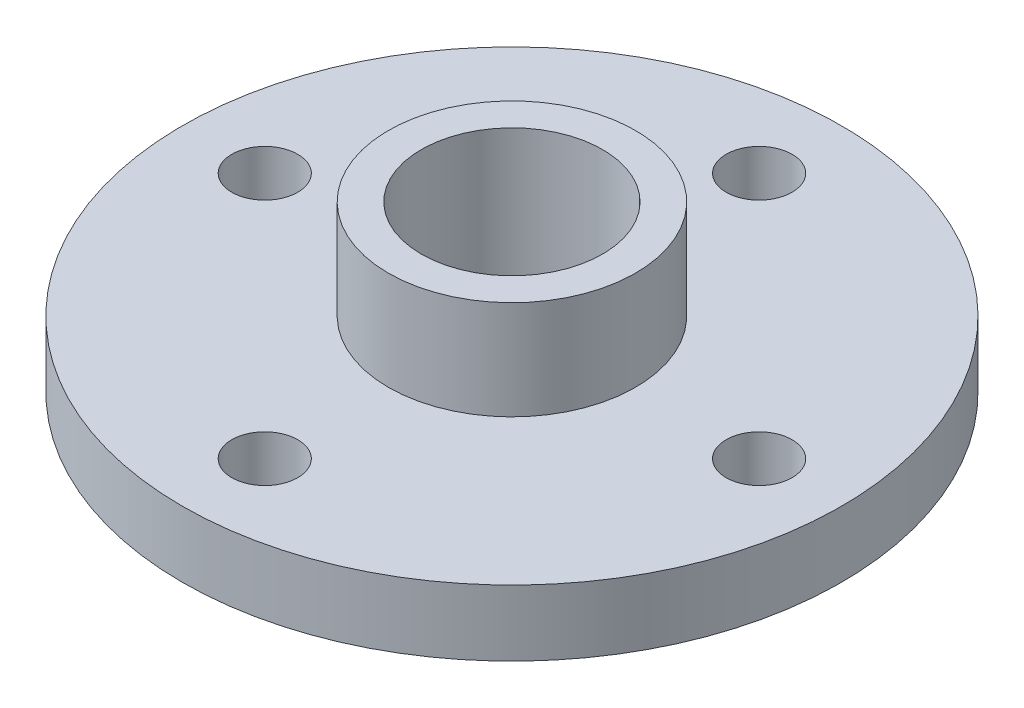
ISO-10303-21;
HEADER;
FILE_DESCRIPTION(('STEP AP214'),'2;1');
FILE_NAME('part.step','',(''),(''),'','','');
FILE_SCHEMA(('AUTOMOTIVE_DESIGN { 1 0 10303 214 1 1 1 1 }'));
ENDSEC;
DATA;
#1=APPLICATION_CONTEXT('core data for automotive mechanical design processes');
#2=APPLICATION_PROTOCOL_DEFINITION('international standard','automotive_design',2000,#1);
#3=PRODUCT_CONTEXT('',#1,'mechanical');
#4=PRODUCT('Part','Part','',(#3));
#5=PRODUCT_RELATED_PRODUCT_CATEGORY('part','',(#4));
#6=PRODUCT_DEFINITION_FORMATION('','',#4);
#7=PRODUCT_DEFINITION_CONTEXT('part definition',#1,'design');
#8=PRODUCT_DEFINITION('design','',#6,#7);
#9=PRODUCT_DEFINITION_SHAPE('','',#8);
#10=(LENGTH_UNIT() NAMED_UNIT(*) SI_UNIT(.MILLI.,.METRE.));
#11=(NAMED_UNIT(*) PLANE_ANGLE_UNIT() SI_UNIT($,.RADIAN.));
#12=(NAMED_UNIT(*) SI_UNIT($,.STERADIAN.) SOLID_ANGLE_UNIT());
#13=UNCERTAINTY_MEASURE_WITH_UNIT(LENGTH_MEASURE(1.E-05),#10,'distance_accuracy_value','');
#14=(GEOMETRIC_REPRESENTATION_CONTEXT(3) GLOBAL_UNCERTAINTY_ASSIGNED_CONTEXT((#13)) GLOBAL_UNIT_ASSIGNED_CONTEXT((#10,
#11,#12)) REPRESENTATION_CONTEXT('',''));
#15=CARTESIAN_POINT('',(0.,0.,0.));
#16=DIRECTION('',(0.,0.,1.));
#17=DIRECTION('',(1.,0.,0.));
#18=AXIS2_PLACEMENT_3D('',#15,#16,#17);
#19=CARTESIAN_POINT('',(0.,0.,0.));
#20=DIRECTION('',(0.,1.,0.));
#21=DIRECTION('',(0.,0.,1.));
#22=AXIS2_PLACEMENT_3D('',#19,#20,#21);
#23=CYLINDRICAL_SURFACE('',#22,1.5);
#24=CARTESIAN_POINT('',(0.,0.,0.));
#25=DIRECTION('',(0.,1.,0.));
#26=DIRECTION('',(0.,0.,1.));
#27=AXIS2_PLACEMENT_3D('',#24,#25,#26);
#28=CIRCLE('',#27,1.5);
#29=CARTESIAN_POINT('',(0.,0.,1.5));
#30=VERTEX_POINT('',#29);
#31=EDGE_CURVE('E83',#30,#30,#28,.T.);
#32=ORIENTED_EDGE('',*,*,#31,.F.);
#33=EDGE_LOOP('',(#32));
#34=FACE_BOUND('',#33,.T.);
#35=CARTESIAN_POINT('',(0.,0.5,0.));
#36=DIRECTION('',(0.,1.,0.));
#37=DIRECTION('',(0.,0.,1.));
#38=AXIS2_PLACEMENT_3D('',#35,#36,#37);
#39=CIRCLE('',#38,1.5);
#40=CARTESIAN_POINT('',(0.,0.5,1.5));
#41=VERTEX_POINT('',#40);
#42=EDGE_CURVE('E45',#41,#41,#39,.F.);
#43=ORIENTED_EDGE('',*,*,#42,.F.);
#44=EDGE_LOOP('',(#43));
#45=FACE_BOUND('',#44,.T.);
#46=ADVANCED_FACE('F41',(#34,#45),#23,.F.);
#47=CARTESIAN_POINT('',(0.,2.,0.));
#48=DIRECTION('',(0.,-1.,0.));
#49=DIRECTION('',(0.,0.,-1.));
#50=AXIS2_PLACEMENT_3D('',#47,#48,#49);
#51=CYLINDRICAL_SURFACE('',#50,10.);
#52=CARTESIAN_POINT('',(0.,2.,0.));
#53=DIRECTION('',(0.,1.,0.));
#54=DIRECTION('',(0.,0.,1.));
#55=AXIS2_PLACEMENT_3D('',#52,#53,#54);
#56=CIRCLE('',#55,10.);
#57=CARTESIAN_POINT('',(0.,2.,10.));
#58=VERTEX_POINT('',#57);
#59=EDGE_CURVE('E10',#58,#58,#56,.T.);
#60=ORIENTED_EDGE('',*,*,#59,.F.);
#61=EDGE_LOOP('',(#60));
#62=FACE_BOUND('',#61,.T.);
#63=CARTESIAN_POINT('',(0.,0.,0.));
#64=DIRECTION('',(0.,1.,0.));
#65=DIRECTION('',(0.,0.,1.));
#66=AXIS2_PLACEMENT_3D('',#63,#64,#65);
#67=CIRCLE('',#66,10.);
#68=CARTESIAN_POINT('',(0.,0.,10.));
#69=VERTEX_POINT('',#68);
#70=EDGE_CURVE('E49',#69,#69,#67,.T.);
#71=ORIENTED_EDGE('',*,*,#70,.T.);
#72=EDGE_LOOP('',(#71));
#73=FACE_BOUND('',#72,.T.);
#74=ADVANCED_FACE('F43',(#62,#73),#51,.T.);
#75=CARTESIAN_POINT('',(0.,2.,0.));
#76=DIRECTION('',(0.,1.,0.));
#77=DIRECTION('',(0.,0.,1.));
#78=AXIS2_PLACEMENT_3D('',#75,#76,#77);
#79=PLANE('',#78);
#80=CARTESIAN_POINT('',(0.,2.,0.));
#81=DIRECTION('',(0.,1.,0.));
#82=DIRECTION('',(0.,0.,1.));
#83=AXIS2_PLACEMENT_3D('',#80,#81,#82);
#84=CIRCLE('',#83,3.75);
#85=CARTESIAN_POINT('',(0.,2.,3.75));
#86=VERTEX_POINT('',#85);
#87=EDGE_CURVE('E80',#86,#86,#84,.T.);
#88=ORIENTED_EDGE('',*,*,#87,.F.);
#89=EDGE_LOOP('',(#88));
#90=FACE_BOUND('',#89,.T.);
#91=CARTESIAN_POINT('',(0.,2.,-7.5));
#92=DIRECTION('',(0.,1.,0.));
#93=DIRECTION('',(0.,0.,1.));
#94=AXIS2_PLACEMENT_3D('',#91,#92,#93);
#95=CIRCLE('',#94,1.);
#96=CARTESIAN_POINT('',(0.,2.,-6.5));
#97=VERTEX_POINT('',#96);
#98=EDGE_CURVE('E75',#97,#97,#95,.T.);
#99=ORIENTED_EDGE('',*,*,#98,.F.);
#100=EDGE_LOOP('',(#99));
#101=FACE_BOUND('',#100,.T.);
#102=CARTESIAN_POINT('',(7.5,2.,0.));
#103=DIRECTION('',(0.,1.,0.));
#104=DIRECTION('',(0.,0.,1.));
#105=AXIS2_PLACEMENT_3D('',#102,#103,#104);
#106=CIRCLE('',#105,1.);
#107=CARTESIAN_POINT('',(7.5,2.,1.));
#108=VERTEX_POINT('',#107);
#109=EDGE_CURVE('E69',#108,#108,#106,.T.);
#110=ORIENTED_EDGE('',*,*,#109,.F.);
#111=EDGE_LOOP('',(#110));
#112=FACE_BOUND('',#111,.T.);
#113=CARTESIAN_POINT('',(0.,2.,7.5));
#114=DIRECTION('',(0.,1.,0.));
#115=DIRECTION('',(0.,0.,-1.));
#116=AXIS2_PLACEMENT_3D('',#113,#114,#115);
#117=CIRCLE('',#116,1.);
#118=CARTESIAN_POINT('',(0.,2.,6.5));
#119=VERTEX_POINT('',#118);
#120=EDGE_CURVE('E63',#119,#119,#117,.T.);
#121=ORIENTED_EDGE('',*,*,#120,.F.);
#122=EDGE_LOOP('',(#121));
#123=FACE_BOUND('',#122,.T.);
#124=CARTESIAN_POINT('',(-7.5,2.,0.));
#125=DIRECTION('',(0.,1.,0.));
#126=DIRECTION('',(0.,0.,-1.));
#127=AXIS2_PLACEMENT_3D('',#124,#125,#126);
#128=CIRCLE('',#127,1.);
#129=CARTESIAN_POINT('',(-7.5,2.,-1.));
#130=VERTEX_POINT('',#129);
#131=EDGE_CURVE('E56',#130,#130,#128,.T.);
#132=ORIENTED_EDGE('',*,*,#131,.F.);
#133=EDGE_LOOP('',(#132));
#134=FACE_BOUND('',#133,.T.);
#135=ORIENTED_EDGE('',*,*,#59,.T.);
#136=EDGE_LOOP('',(#135));
#137=FACE_BOUND('',#136,.T.);
#138=ADVANCED_FACE('F108',(#90,#101,#112,#123,#134,#137),#79,.T.);
#139=CARTESIAN_POINT('',(0.,0.,0.));
#140=DIRECTION('',(0.,1.,0.));
#141=DIRECTION('',(0.,0.,1.));
#142=AXIS2_PLACEMENT_3D('',#139,#140,#141);
#143=PLANE('',#142);
#144=ORIENTED_EDGE('',*,*,#31,.T.);
#145=EDGE_LOOP('',(#144));
#146=FACE_BOUND('',#145,.T.);
#147=CARTESIAN_POINT('',(0.,0.,-7.5));
#148=DIRECTION('',(0.,1.,0.));
#149=DIRECTION('',(0.,0.,1.));
#150=AXIS2_PLACEMENT_3D('',#147,#148,#149);
#151=CIRCLE('',#150,1.);
#152=CARTESIAN_POINT('',(0.,0.,-6.5));
#153=VERTEX_POINT('',#152);
#154=EDGE_CURVE('E54',#153,#153,#151,.T.);
#155=ORIENTED_EDGE('',*,*,#154,.T.);
#156=EDGE_LOOP('',(#155));
#157=FACE_BOUND('',#156,.T.);
#158=CARTESIAN_POINT('',(7.5,0.,0.));
#159=DIRECTION('',(0.,1.,0.));
#160=DIRECTION('',(0.,0.,1.));
#161=AXIS2_PLACEMENT_3D('',#158,#159,#160);
#162=CIRCLE('',#161,1.);
#163=CARTESIAN_POINT('',(7.5,0.,1.));
#164=VERTEX_POINT('',#163);
#165=EDGE_CURVE('E72',#164,#164,#162,.T.);
#166=ORIENTED_EDGE('',*,*,#165,.T.);
#167=EDGE_LOOP('',(#166));
#168=FACE_BOUND('',#167,.T.);
#169=CARTESIAN_POINT('',(0.,0.,7.5));
#170=DIRECTION('',(0.,1.,0.));
#171=DIRECTION('',(0.,0.,-1.));
#172=AXIS2_PLACEMENT_3D('',#169,#170,#171);
#173=CIRCLE('',#172,1.);
#174=CARTESIAN_POINT('',(0.,0.,6.5));
#175=VERTEX_POINT('',#174);
#176=EDGE_CURVE('E66',#175,#175,#173,.T.);
#177=ORIENTED_EDGE('',*,*,#176,.T.);
#178=EDGE_LOOP('',(#177));
#179=FACE_BOUND('',#178,.T.);
#180=CARTESIAN_POINT('',(-7.5,0.,0.));
#181=DIRECTION('',(0.,1.,0.));
#182=DIRECTION('',(0.,0.,-1.));
#183=AXIS2_PLACEMENT_3D('',#180,#181,#182);
#184=CIRCLE('',#183,1.);
#185=CARTESIAN_POINT('',(-7.5,0.,-1.));
#186=VERTEX_POINT('',#185);
#187=EDGE_CURVE('E59',#186,#186,#184,.T.);
#188=ORIENTED_EDGE('',*,*,#187,.T.);
#189=EDGE_LOOP('',(#188));
#190=FACE_BOUND('',#189,.T.);
#191=ORIENTED_EDGE('',*,*,#70,.F.);
#192=EDGE_LOOP('',(#191));
#193=FACE_BOUND('',#192,.T.);
#194=ADVANCED_FACE('F137',(#146,#157,#168,#179,#190,#193),#143,.F.);
#195=CARTESIAN_POINT('',(-7.5,0.,0.));
#196=DIRECTION('',(0.,1.,0.));
#197=DIRECTION('',(0.,0.,1.));
#198=AXIS2_PLACEMENT_3D('',#195,#196,#197);
#199=CYLINDRICAL_SURFACE('',#198,1.);
#200=ORIENTED_EDGE('',*,*,#187,.F.);
#201=EDGE_LOOP('',(#200));
#202=FACE_BOUND('',#201,.T.);
#203=ORIENTED_EDGE('',*,*,#131,.T.);
#204=EDGE_LOOP('',(#203));
#205=FACE_BOUND('',#204,.T.);
#206=ADVANCED_FACE('F133',(#202,#205),#199,.F.);
#207=CARTESIAN_POINT('',(0.,0.,7.5));
#208=DIRECTION('',(0.,1.,0.));
#209=DIRECTION('',(0.,0.,1.));
#210=AXIS2_PLACEMENT_3D('',#207,#208,#209);
#211=CYLINDRICAL_SURFACE('',#210,1.);
#212=ORIENTED_EDGE('',*,*,#176,.F.);
#213=EDGE_LOOP('',(#212));
#214=FACE_BOUND('',#213,.T.);
#215=ORIENTED_EDGE('',*,*,#120,.T.);
#216=EDGE_LOOP('',(#215));
#217=FACE_BOUND('',#216,.T.);
#218=ADVANCED_FACE('F129',(#214,#217),#211,.F.);
#219=CARTESIAN_POINT('',(7.5,0.,0.));
#220=DIRECTION('',(0.,1.,0.));
#221=DIRECTION('',(0.,0.,1.));
#222=AXIS2_PLACEMENT_3D('',#219,#220,#221);
#223=CYLINDRICAL_SURFACE('',#222,1.);
#224=ORIENTED_EDGE('',*,*,#165,.F.);
#225=EDGE_LOOP('',(#224));
#226=FACE_BOUND('',#225,.T.);
#227=ORIENTED_EDGE('',*,*,#109,.T.);
#228=EDGE_LOOP('',(#227));
#229=FACE_BOUND('',#228,.T.);
#230=ADVANCED_FACE('F125',(#226,#229),#223,.F.);
#231=CARTESIAN_POINT('',(0.,0.,-7.5));
#232=DIRECTION('',(0.,1.,0.));
#233=DIRECTION('',(0.,0.,1.));
#234=AXIS2_PLACEMENT_3D('',#231,#232,#233);
#235=CYLINDRICAL_SURFACE('',#234,1.);
#236=ORIENTED_EDGE('',*,*,#154,.F.);
#237=EDGE_LOOP('',(#236));
#238=FACE_BOUND('',#237,.T.);
#239=ORIENTED_EDGE('',*,*,#98,.T.);
#240=EDGE_LOOP('',(#239));
#241=FACE_BOUND('',#240,.T.);
#242=ADVANCED_FACE('F121',(#238,#241),#235,.F.);
#243=CARTESIAN_POINT('',(0.,5.,0.));
#244=DIRECTION('',(0.,-1.,0.));
#245=DIRECTION('',(0.,0.,-1.));
#246=AXIS2_PLACEMENT_3D('',#243,#244,#245);
#247=CYLINDRICAL_SURFACE('',#246,3.75);
#248=CARTESIAN_POINT('',(0.,5.,0.));
#249=DIRECTION('',(0.,1.,0.));
#250=DIRECTION('',(0.,0.,1.));
#251=AXIS2_PLACEMENT_3D('',#248,#249,#250);
#252=CIRCLE('',#251,3.75);
#253=CARTESIAN_POINT('',(0.,5.,3.75));
#254=VERTEX_POINT('',#253);
#255=EDGE_CURVE('E60',#254,#254,#252,.T.);
#256=ORIENTED_EDGE('',*,*,#255,.F.);
#257=EDGE_LOOP('',(#256));
#258=FACE_BOUND('',#257,.T.);
#259=ORIENTED_EDGE('',*,*,#87,.T.);
#260=EDGE_LOOP('',(#259));
#261=FACE_BOUND('',#260,.T.);
#262=ADVANCED_FACE('F117',(#258,#261),#247,.T.);
#263=CARTESIAN_POINT('',(0.,5.,0.));
#264=DIRECTION('',(0.,1.,0.));
#265=DIRECTION('',(0.,0.,1.));
#266=AXIS2_PLACEMENT_3D('',#263,#264,#265);
#267=PLANE('',#266);
#268=CARTESIAN_POINT('',(0.,5.,0.));
#269=DIRECTION('',(0.,1.,0.));
#270=DIRECTION('',(0.,0.,1.));
#271=AXIS2_PLACEMENT_3D('',#268,#269,#270);
#272=CIRCLE('',#271,2.75);
#273=CARTESIAN_POINT('',(0.,5.,2.75));
#274=VERTEX_POINT('',#273);
#275=EDGE_CURVE('E88',#274,#274,#272,.T.);
#276=ORIENTED_EDGE('',*,*,#275,.F.);
#277=EDGE_LOOP('',(#276));
#278=FACE_BOUND('',#277,.T.);
#279=ORIENTED_EDGE('',*,*,#255,.T.);
#280=EDGE_LOOP('',(#279));
#281=FACE_BOUND('',#280,.T.);
#282=ADVANCED_FACE('F115',(#278,#281),#267,.T.);
#283=CARTESIAN_POINT('',(0.,0.5,0.));
#284=DIRECTION('',(0.,1.,0.));
#285=DIRECTION('',(0.,0.,1.));
#286=AXIS2_PLACEMENT_3D('',#283,#284,#285);
#287=PLANE('',#286);
#288=CARTESIAN_POINT('',(0.,0.5,0.));
#289=DIRECTION('',(0.,1.,0.));
#290=DIRECTION('',(0.,0.,1.));
#291=AXIS2_PLACEMENT_3D('',#288,#289,#290);
#292=CIRCLE('',#291,2.75);
#293=CARTESIAN_POINT('',(0.,0.5,2.75));
#294=VERTEX_POINT('',#293);
#295=EDGE_CURVE('E91',#294,#294,#292,.T.);
#296=ORIENTED_EDGE('',*,*,#295,.T.);
#297=EDGE_LOOP('',(#296));
#298=FACE_BOUND('',#297,.T.);
#299=ORIENTED_EDGE('',*,*,#42,.T.);
#300=EDGE_LOOP('',(#299));
#301=FACE_BOUND('',#300,.T.);
#302=ADVANCED_FACE('F98',(#298,#301),#287,.T.);
#303=CARTESIAN_POINT('',(0.,0.5,0.));
#304=DIRECTION('',(0.,1.,0.));
#305=DIRECTION('',(0.,0.,1.));
#306=AXIS2_PLACEMENT_3D('',#303,#304,#305);
#307=CYLINDRICAL_SURFACE('',#306,2.75);
#308=ORIENTED_EDGE('',*,*,#295,.F.);
#309=EDGE_LOOP('',(#308));
#310=FACE_BOUND('',#309,.T.);
#311=ORIENTED_EDGE('',*,*,#275,.T.);
#312=EDGE_LOOP('',(#311));
#313=FACE_BOUND('',#312,.T.);
#314=ADVANCED_FACE('F113',(#310,#313),#307,.F.);
#315=CLOSED_SHELL('',(#46,#74,#138,#194,#206,#218,#230,#242,#262,#282,#302,#314));
#316=MANIFOLD_SOLID_BREP('B2',#315);
#317=ADVANCED_BREP_SHAPE_REPRESENTATION('',(#18,#316),#14);
#318=SHAPE_DEFINITION_REPRESENTATION(#9,#317);
ENDSEC;
END-ISO-10303-21;
